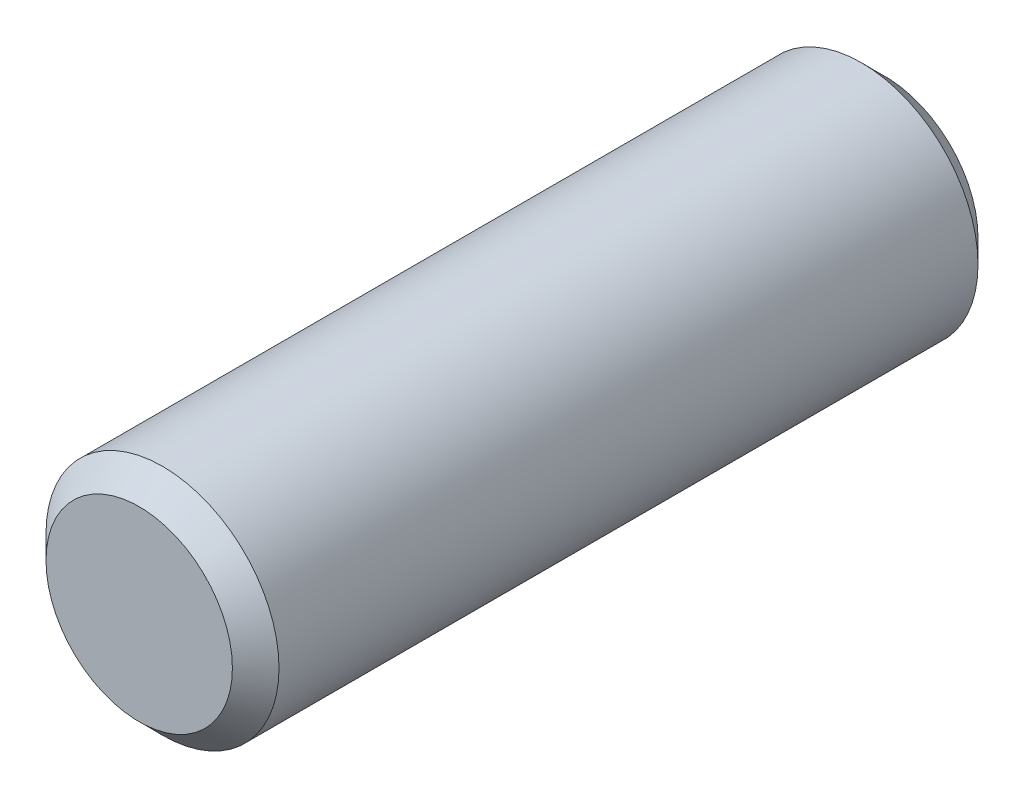
ISO-10303-21;
HEADER;
FILE_DESCRIPTION(('STEP AP214'),'2;1');
FILE_NAME('part.step','',(''),(''),'','','');
FILE_SCHEMA(('AUTOMOTIVE_DESIGN { 1 0 10303 214 1 1 1 1 }'));
ENDSEC;
DATA;
#1=APPLICATION_CONTEXT('core data for automotive mechanical design processes');
#2=APPLICATION_PROTOCOL_DEFINITION('international standard','automotive_design',2000,#1);
#3=PRODUCT_CONTEXT('',#1,'mechanical');
#4=PRODUCT('Part','Part','',(#3));
#5=PRODUCT_RELATED_PRODUCT_CATEGORY('part','',(#4));
#6=PRODUCT_DEFINITION_FORMATION('','',#4);
#7=PRODUCT_DEFINITION_CONTEXT('part definition',#1,'design');
#8=PRODUCT_DEFINITION('design','',#6,#7);
#9=PRODUCT_DEFINITION_SHAPE('','',#8);
#10=(LENGTH_UNIT() NAMED_UNIT(*) SI_UNIT(.MILLI.,.METRE.));
#11=(NAMED_UNIT(*) PLANE_ANGLE_UNIT() SI_UNIT($,.RADIAN.));
#12=(NAMED_UNIT(*) SI_UNIT($,.STERADIAN.) SOLID_ANGLE_UNIT());
#13=UNCERTAINTY_MEASURE_WITH_UNIT(LENGTH_MEASURE(1.E-05),#10,'distance_accuracy_value','');
#14=(GEOMETRIC_REPRESENTATION_CONTEXT(3) GLOBAL_UNCERTAINTY_ASSIGNED_CONTEXT((#13)) GLOBAL_UNIT_ASSIGNED_CONTEXT((#10,
#11,#12)) REPRESENTATION_CONTEXT('',''));
#15=CARTESIAN_POINT('',(0.,0.,0.));
#16=DIRECTION('',(0.,0.,1.));
#17=DIRECTION('',(1.,0.,0.));
#18=AXIS2_PLACEMENT_3D('',#15,#16,#17);
#19=CARTESIAN_POINT('',(0.,0.,8.));
#20=DIRECTION('',(0.,0.,-1.));
#21=DIRECTION('',(-1.,0.,0.));
#22=AXIS2_PLACEMENT_3D('',#19,#20,#21);
#23=CYLINDRICAL_SURFACE('',#22,2.5);
#24=CARTESIAN_POINT('',(0.,0.,-7.5));
#25=DIRECTION('',(0.,0.,1.));
#26=DIRECTION('',(1.,0.,0.));
#27=AXIS2_PLACEMENT_3D('',#24,#25,#26);
#28=CIRCLE('',#27,2.5);
#29=CARTESIAN_POINT('',(2.5,0.,-7.5));
#30=VERTEX_POINT('',#29);
#31=EDGE_CURVE('E42',#30,#30,#28,.T.);
#32=ORIENTED_EDGE('',*,*,#31,.T.);
#33=EDGE_LOOP('',(#32));
#34=FACE_BOUND('',#33,.T.);
#35=CARTESIAN_POINT('',(0.,0.,7.5));
#36=DIRECTION('',(0.,0.,1.));
#37=DIRECTION('',(1.,0.,0.));
#38=AXIS2_PLACEMENT_3D('',#35,#36,#37);
#39=CIRCLE('',#38,2.5);
#40=CARTESIAN_POINT('',(2.5,0.,7.5));
#41=VERTEX_POINT('',#40);
#42=EDGE_CURVE('E46',#41,#41,#39,.F.);
#43=ORIENTED_EDGE('',*,*,#42,.T.);
#44=EDGE_LOOP('',(#43));
#45=FACE_BOUND('',#44,.T.);
#46=ADVANCED_FACE('F31',(#34,#45),#23,.T.);
#47=CARTESIAN_POINT('',(0.,0.,8.));
#48=DIRECTION('',(0.,0.,1.));
#49=DIRECTION('',(1.,0.,0.));
#50=AXIS2_PLACEMENT_3D('',#47,#48,#49);
#51=PLANE('',#50);
#52=CARTESIAN_POINT('',(0.,0.,8.));
#53=DIRECTION('',(0.,0.,1.));
#54=DIRECTION('',(1.,0.,0.));
#55=AXIS2_PLACEMENT_3D('',#52,#53,#54);
#56=CIRCLE('',#55,2.);
#57=CARTESIAN_POINT('',(2.,0.,8.));
#58=VERTEX_POINT('',#57);
#59=EDGE_CURVE('E10',#58,#58,#56,.T.);
#60=ORIENTED_EDGE('',*,*,#59,.T.);
#61=EDGE_LOOP('',(#60));
#62=FACE_BOUND('',#61,.T.);
#63=ADVANCED_FACE('F62',(#62),#51,.T.);
#64=CARTESIAN_POINT('',(0.,0.,-8.));
#65=DIRECTION('',(0.,0.,1.));
#66=DIRECTION('',(1.,0.,0.));
#67=AXIS2_PLACEMENT_3D('',#64,#65,#66);
#68=PLANE('',#67);
#69=CARTESIAN_POINT('',(0.,0.,-8.));
#70=DIRECTION('',(0.,0.,1.));
#71=DIRECTION('',(1.,0.,0.));
#72=AXIS2_PLACEMENT_3D('',#69,#70,#71);
#73=CIRCLE('',#72,2.);
#74=CARTESIAN_POINT('',(2.,0.,-8.));
#75=VERTEX_POINT('',#74);
#76=EDGE_CURVE('E38',#75,#75,#73,.F.);
#77=ORIENTED_EDGE('',*,*,#76,.T.);
#78=EDGE_LOOP('',(#77));
#79=FACE_BOUND('',#78,.T.);
#80=ADVANCED_FACE('F59',(#79),#68,.F.);
#81=CARTESIAN_POINT('',(0.,0.,-7.5));
#82=DIRECTION('',(0.,0.,1.));
#83=DIRECTION('',(1.,0.,0.));
#84=AXIS2_PLACEMENT_3D('',#81,#82,#83);
#85=CONICAL_SURFACE('',#84,2.5,0.785398163397451);
#86=ORIENTED_EDGE('',*,*,#76,.F.);
#87=EDGE_LOOP('',(#86));
#88=FACE_BOUND('',#87,.T.);
#89=ORIENTED_EDGE('',*,*,#31,.F.);
#90=EDGE_LOOP('',(#89));
#91=FACE_BOUND('',#90,.T.);
#92=ADVANCED_FACE('F55',(#88,#91),#85,.T.);
#93=CARTESIAN_POINT('',(0.,0.,8.));
#94=DIRECTION('',(0.,0.,-1.));
#95=DIRECTION('',(-1.,0.,0.));
#96=AXIS2_PLACEMENT_3D('',#93,#94,#95);
#97=CONICAL_SURFACE('',#96,2.,0.785398163397447);
#98=ORIENTED_EDGE('',*,*,#42,.F.);
#99=EDGE_LOOP('',(#98));
#100=FACE_BOUND('',#99,.T.);
#101=ORIENTED_EDGE('',*,*,#59,.F.);
#102=EDGE_LOOP('',(#101));
#103=FACE_BOUND('',#102,.T.);
#104=ADVANCED_FACE('F33',(#100,#103),#97,.T.);
#105=CLOSED_SHELL('',(#46,#63,#80,#92,#104));
#106=MANIFOLD_SOLID_BREP('B2',#105);
#107=ADVANCED_BREP_SHAPE_REPRESENTATION('',(#18,#106),#14);
#108=SHAPE_DEFINITION_REPRESENTATION(#9,#107);
ENDSEC;
END-ISO-10303-21;
